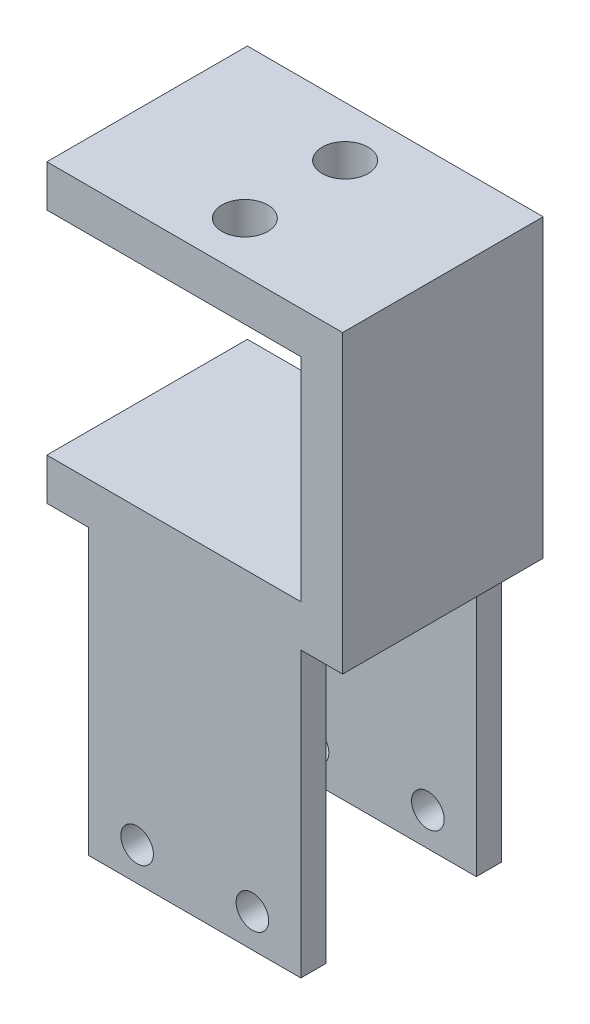
ISO-10303-21;
HEADER;
FILE_DESCRIPTION(('STEP AP214'),'2;1');
FILE_NAME('part.step','',(''),(''),'','','');
FILE_SCHEMA(('AUTOMOTIVE_DESIGN { 1 0 10303 214 1 1 1 1 }'));
ENDSEC;
DATA;
#1=APPLICATION_CONTEXT('core data for automotive mechanical design processes');
#2=APPLICATION_PROTOCOL_DEFINITION('international standard','automotive_design',2000,#1);
#3=PRODUCT_CONTEXT('',#1,'mechanical');
#4=PRODUCT('Part','Part','',(#3));
#5=PRODUCT_RELATED_PRODUCT_CATEGORY('part','',(#4));
#6=PRODUCT_DEFINITION_FORMATION('','',#4);
#7=PRODUCT_DEFINITION_CONTEXT('part definition',#1,'design');
#8=PRODUCT_DEFINITION('design','',#6,#7);
#9=PRODUCT_DEFINITION_SHAPE('','',#8);
#10=(LENGTH_UNIT() NAMED_UNIT(*) SI_UNIT(.MILLI.,.METRE.));
#11=(NAMED_UNIT(*) PLANE_ANGLE_UNIT() SI_UNIT($,.RADIAN.));
#12=(NAMED_UNIT(*) SI_UNIT($,.STERADIAN.) SOLID_ANGLE_UNIT());
#13=UNCERTAINTY_MEASURE_WITH_UNIT(LENGTH_MEASURE(1.E-05),#10,'distance_accuracy_value','');
#14=(GEOMETRIC_REPRESENTATION_CONTEXT(3) GLOBAL_UNCERTAINTY_ASSIGNED_CONTEXT((#13)) GLOBAL_UNIT_ASSIGNED_CONTEXT((#10,
#11,#12)) REPRESENTATION_CONTEXT('',''));
#15=CARTESIAN_POINT('',(0.,0.,0.));
#16=DIRECTION('',(0.,0.,1.));
#17=DIRECTION('',(1.,0.,0.));
#18=AXIS2_PLACEMENT_3D('',#15,#16,#17);
#19=CARTESIAN_POINT('',(-35.4,0.,24.));
#20=DIRECTION('',(1.,0.,0.));
#21=DIRECTION('',(0.,0.,-1.));
#22=AXIS2_PLACEMENT_3D('',#19,#20,#21);
#23=PLANE('',#22);
#24=DIRECTION('',(0.,-1.,0.));
#25=VECTOR('',#24,1.);
#26=CARTESIAN_POINT('',(-35.4,0.,0.));
#27=LINE('',#26,#25);
#28=CARTESIAN_POINT('',(-35.4,35.4,0.));
#29=VERTEX_POINT('',#28);
#30=CARTESIAN_POINT('',(-35.4,30.4,0.));
#31=VERTEX_POINT('',#30);
#32=EDGE_CURVE('E204',#29,#31,#27,.T.);
#33=ORIENTED_EDGE('',*,*,#32,.T.);
#34=DIRECTION('',(0.,0.,-1.));
#35=VECTOR('',#34,1.);
#36=CARTESIAN_POINT('',(-35.4,30.4,24.));
#37=LINE('',#36,#35);
#38=CARTESIAN_POINT('',(-35.4,30.4,24.));
#39=VERTEX_POINT('',#38);
#40=EDGE_CURVE('E173',#39,#31,#37,.T.);
#41=ORIENTED_EDGE('',*,*,#40,.F.);
#42=DIRECTION('',(0.,-1.,0.));
#43=VECTOR('',#42,1.);
#44=CARTESIAN_POINT('',(-35.4,0.,24.));
#45=LINE('',#44,#43);
#46=CARTESIAN_POINT('',(-35.4,35.4,24.));
#47=VERTEX_POINT('',#46);
#48=EDGE_CURVE('E179',#47,#39,#45,.T.);
#49=ORIENTED_EDGE('',*,*,#48,.F.);
#50=DIRECTION('',(0.,0.,-1.));
#51=VECTOR('',#50,1.);
#52=CARTESIAN_POINT('',(-35.4,35.4,24.));
#53=LINE('',#52,#51);
#54=EDGE_CURVE('E236',#47,#29,#53,.T.);
#55=ORIENTED_EDGE('',*,*,#54,.T.);
#56=EDGE_LOOP('',(#33,#41,#49,#55));
#57=FACE_BOUND('',#56,.T.);
#58=ADVANCED_FACE('F39',(#57),#23,.F.);
#59=CARTESIAN_POINT('',(-30.4,-34.,24.));
#60=DIRECTION('',(1.,0.,0.));
#61=DIRECTION('',(0.,0.,-1.));
#62=AXIS2_PLACEMENT_3D('',#59,#60,#61);
#63=PLANE('',#62);
#64=DIRECTION('',(0.,0.,-1.));
#65=VECTOR('',#64,1.);
#66=CARTESIAN_POINT('',(-30.4,-34.,24.));
#67=LINE('',#66,#65);
#68=CARTESIAN_POINT('',(-30.4,-34.,3.));
#69=VERTEX_POINT('',#68);
#70=CARTESIAN_POINT('',(-30.4,-34.,0.));
#71=VERTEX_POINT('',#70);
#72=EDGE_CURVE('E227',#69,#71,#67,.T.);
#73=ORIENTED_EDGE('',*,*,#72,.F.);
#74=DIRECTION('',(0.,1.,0.));
#75=VECTOR('',#74,1.);
#76=CARTESIAN_POINT('',(-30.4,-34.,3.));
#77=LINE('',#76,#75);
#78=CARTESIAN_POINT('',(-30.4,0.,3.));
#79=VERTEX_POINT('',#78);
#80=EDGE_CURVE('E274',#69,#79,#77,.T.);
#81=ORIENTED_EDGE('',*,*,#80,.T.);
#82=DIRECTION('',(0.,0.,-1.));
#83=VECTOR('',#82,1.);
#84=CARTESIAN_POINT('',(-30.4,0.,24.));
#85=LINE('',#84,#83);
#86=CARTESIAN_POINT('',(-30.4,0.,0.));
#87=VERTEX_POINT('',#86);
#88=EDGE_CURVE('E231',#79,#87,#85,.T.);
#89=ORIENTED_EDGE('',*,*,#88,.T.);
#90=DIRECTION('',(0.,-1.,0.));
#91=VECTOR('',#90,1.);
#92=CARTESIAN_POINT('',(-30.4,-34.,0.));
#93=LINE('',#92,#91);
#94=EDGE_CURVE('E210',#87,#71,#93,.T.);
#95=ORIENTED_EDGE('',*,*,#94,.T.);
#96=EDGE_LOOP('',(#73,#81,#89,#95));
#97=FACE_BOUND('',#96,.T.);
#98=ADVANCED_FACE('F336',(#97),#63,.F.);
#99=CARTESIAN_POINT('',(-30.4,-34.,24.));
#100=DIRECTION('',(0.,1.,0.));
#101=DIRECTION('',(0.,0.,1.));
#102=AXIS2_PLACEMENT_3D('',#99,#100,#101);
#103=PLANE('',#102);
#104=DIRECTION('',(0.,0.,-1.));
#105=VECTOR('',#104,1.);
#106=CARTESIAN_POINT('',(-5.,-34.,24.));
#107=LINE('',#106,#105);
#108=CARTESIAN_POINT('',(-5.,-34.,3.));
#109=VERTEX_POINT('',#108);
#110=CARTESIAN_POINT('',(-5.,-34.,0.));
#111=VERTEX_POINT('',#110);
#112=EDGE_CURVE('E223',#109,#111,#107,.T.);
#113=ORIENTED_EDGE('',*,*,#112,.F.);
#114=DIRECTION('',(-1.,0.,0.));
#115=VECTOR('',#114,1.);
#116=CARTESIAN_POINT('',(0.,-34.,3.));
#117=LINE('',#116,#115);
#118=EDGE_CURVE('E260',#109,#69,#117,.T.);
#119=ORIENTED_EDGE('',*,*,#118,.T.);
#120=ORIENTED_EDGE('',*,*,#72,.T.);
#121=DIRECTION('',(1.,0.,0.));
#122=VECTOR('',#121,1.);
#123=CARTESIAN_POINT('',(-30.4,-34.,0.));
#124=LINE('',#123,#122);
#125=EDGE_CURVE('E213',#71,#111,#124,.T.);
#126=ORIENTED_EDGE('',*,*,#125,.T.);
#127=EDGE_LOOP('',(#113,#119,#120,#126));
#128=FACE_BOUND('',#127,.T.);
#129=ADVANCED_FACE('F343',(#128),#103,.F.);
#130=CARTESIAN_POINT('',(-4.99999999999999,0.,24.));
#131=DIRECTION('',(-1.,0.,0.));
#132=DIRECTION('',(0.,-1.,0.));
#133=AXIS2_PLACEMENT_3D('',#130,#131,#132);
#134=PLANE('',#133);
#135=DIRECTION('',(0.,0.,-1.));
#136=VECTOR('',#135,1.);
#137=CARTESIAN_POINT('',(-4.99999999999999,0.,24.));
#138=LINE('',#137,#136);
#139=CARTESIAN_POINT('',(-4.99999999999999,0.,3.));
#140=VERTEX_POINT('',#139);
#141=CARTESIAN_POINT('',(-4.99999999999999,0.,0.));
#142=VERTEX_POINT('',#141);
#143=EDGE_CURVE('E194',#140,#142,#138,.T.);
#144=ORIENTED_EDGE('',*,*,#143,.F.);
#145=DIRECTION('',(0.,-1.,0.));
#146=VECTOR('',#145,1.);
#147=CARTESIAN_POINT('',(-4.99999999999999,0.,3.));
#148=LINE('',#147,#146);
#149=EDGE_CURVE('E271',#140,#109,#148,.T.);
#150=ORIENTED_EDGE('',*,*,#149,.T.);
#151=ORIENTED_EDGE('',*,*,#112,.T.);
#152=DIRECTION('',(0.,1.,0.));
#153=VECTOR('',#152,1.);
#154=CARTESIAN_POINT('',(-4.99999999999999,0.,0.));
#155=LINE('',#154,#153);
#156=EDGE_CURVE('E216',#111,#142,#155,.T.);
#157=ORIENTED_EDGE('',*,*,#156,.T.);
#158=EDGE_LOOP('',(#144,#150,#151,#157));
#159=FACE_BOUND('',#158,.T.);
#160=ADVANCED_FACE('F410',(#159),#134,.F.);
#161=CARTESIAN_POINT('',(-24.6,-30.,24.));
#162=DIRECTION('',(0.,0.,-1.));
#163=DIRECTION('',(-1.,0.,0.));
#164=AXIS2_PLACEMENT_3D('',#161,#162,#163);
#165=CYLINDRICAL_SURFACE('',#164,1.95);
#166=CARTESIAN_POINT('',(-24.6,-30.,3.));
#167=DIRECTION('',(0.,0.,-1.));
#168=DIRECTION('',(0.,1.,0.));
#169=AXIS2_PLACEMENT_3D('',#166,#167,#168);
#170=CIRCLE('',#169,1.95);
#171=CARTESIAN_POINT('',(-24.6,-28.05,3.));
#172=VERTEX_POINT('',#171);
#173=EDGE_CURVE('E268',#172,#172,#170,.T.);
#174=ORIENTED_EDGE('',*,*,#173,.F.);
#175=EDGE_LOOP('',(#174));
#176=FACE_BOUND('',#175,.T.);
#177=CARTESIAN_POINT('',(-24.6,-30.,0.));
#178=DIRECTION('',(0.,0.,1.));
#179=DIRECTION('',(1.,0.,0.));
#180=AXIS2_PLACEMENT_3D('',#177,#178,#179);
#181=CIRCLE('',#180,1.95);
#182=CARTESIAN_POINT('',(-22.65,-30.,0.));
#183=VERTEX_POINT('',#182);
#184=EDGE_CURVE('E280',#183,#183,#181,.T.);
#185=ORIENTED_EDGE('',*,*,#184,.F.);
#186=EDGE_LOOP('',(#185));
#187=FACE_BOUND('',#186,.T.);
#188=ADVANCED_FACE('F404',(#176,#187),#165,.F.);
#189=CARTESIAN_POINT('',(-10.8,-30.,24.));
#190=DIRECTION('',(0.,0.,-1.));
#191=DIRECTION('',(-1.,0.,0.));
#192=AXIS2_PLACEMENT_3D('',#189,#190,#191);
#193=CYLINDRICAL_SURFACE('',#192,1.95);
#194=CARTESIAN_POINT('',(-10.8,-30.,3.));
#195=DIRECTION('',(0.,0.,-1.));
#196=DIRECTION('',(0.,1.,0.));
#197=AXIS2_PLACEMENT_3D('',#194,#195,#196);
#198=CIRCLE('',#197,1.95);
#199=CARTESIAN_POINT('',(-10.8,-28.05,3.));
#200=VERTEX_POINT('',#199);
#201=EDGE_CURVE('E43',#200,#200,#198,.T.);
#202=ORIENTED_EDGE('',*,*,#201,.F.);
#203=EDGE_LOOP('',(#202));
#204=FACE_BOUND('',#203,.T.);
#205=CARTESIAN_POINT('',(-10.8,-30.,0.));
#206=DIRECTION('',(0.,0.,1.));
#207=DIRECTION('',(1.,0.,0.));
#208=AXIS2_PLACEMENT_3D('',#205,#206,#207);
#209=CIRCLE('',#208,1.95);
#210=CARTESIAN_POINT('',(-8.85,-30.,0.));
#211=VERTEX_POINT('',#210);
#212=EDGE_CURVE('E276',#211,#211,#209,.T.);
#213=ORIENTED_EDGE('',*,*,#212,.F.);
#214=EDGE_LOOP('',(#213));
#215=FACE_BOUND('',#214,.T.);
#216=ADVANCED_FACE('F402',(#204,#215),#193,.F.);
#217=CARTESIAN_POINT('',(0.,0.,24.));
#218=DIRECTION('',(0.,0.,1.));
#219=DIRECTION('',(1.,0.,0.));
#220=AXIS2_PLACEMENT_3D('',#217,#218,#219);
#221=PLANE('',#220);
#222=ORIENTED_EDGE('',*,*,#48,.T.);
#223=DIRECTION('',(-1.,0.,0.));
#224=VECTOR('',#223,1.);
#225=CARTESIAN_POINT('',(-30.4,30.4,24.));
#226=LINE('',#225,#224);
#227=CARTESIAN_POINT('',(-5.,30.4,24.));
#228=VERTEX_POINT('',#227);
#229=EDGE_CURVE('E289',#228,#39,#226,.T.);
#230=ORIENTED_EDGE('',*,*,#229,.F.);
#231=DIRECTION('',(0.,1.,0.));
#232=VECTOR('',#231,1.);
#233=CARTESIAN_POINT('',(-5.,30.4,24.));
#234=LINE('',#233,#232);
#235=CARTESIAN_POINT('',(-5.,5.,24.));
#236=VERTEX_POINT('',#235);
#237=EDGE_CURVE('E161',#236,#228,#234,.T.);
#238=ORIENTED_EDGE('',*,*,#237,.F.);
#239=DIRECTION('',(1.,0.,0.));
#240=VECTOR('',#239,1.);
#241=CARTESIAN_POINT('',(-30.4,5.,24.));
#242=LINE('',#241,#240);
#243=CARTESIAN_POINT('',(-35.4,5.,24.));
#244=VERTEX_POINT('',#243);
#245=EDGE_CURVE('E152',#244,#236,#242,.T.);
#246=ORIENTED_EDGE('',*,*,#245,.F.);
#247=CARTESIAN_POINT('',(-35.4,0.,24.));
#248=VERTEX_POINT('',#247);
#249=EDGE_CURVE('E158',#244,#248,#45,.T.);
#250=ORIENTED_EDGE('',*,*,#249,.T.);
#251=DIRECTION('',(1.,0.,0.));
#252=VECTOR('',#251,1.);
#253=CARTESIAN_POINT('',(-35.4,0.,24.));
#254=LINE('',#253,#252);
#255=CARTESIAN_POINT('',(-30.4,0.,24.));
#256=VERTEX_POINT('',#255);
#257=EDGE_CURVE('E182',#248,#256,#254,.T.);
#258=ORIENTED_EDGE('',*,*,#257,.T.);
#259=DIRECTION('',(0.,-1.,0.));
#260=VECTOR('',#259,1.);
#261=CARTESIAN_POINT('',(-30.4,-34.,24.));
#262=LINE('',#261,#260);
#263=CARTESIAN_POINT('',(-30.4,-34.,24.));
#264=VERTEX_POINT('',#263);
#265=EDGE_CURVE('E188',#256,#264,#262,.T.);
#266=ORIENTED_EDGE('',*,*,#265,.T.);
#267=DIRECTION('',(1.,0.,0.));
#268=VECTOR('',#267,1.);
#269=CARTESIAN_POINT('',(-30.4,-34.,24.));
#270=LINE('',#269,#268);
#271=CARTESIAN_POINT('',(-5.,-34.,24.));
#272=VERTEX_POINT('',#271);
#273=EDGE_CURVE('E190',#264,#272,#270,.T.);
#274=ORIENTED_EDGE('',*,*,#273,.T.);
#275=DIRECTION('',(0.,1.,0.));
#276=VECTOR('',#275,1.);
#277=CARTESIAN_POINT('',(-4.99999999999999,0.,24.));
#278=LINE('',#277,#276);
#279=CARTESIAN_POINT('',(-4.99999999999999,0.,24.));
#280=VERTEX_POINT('',#279);
#281=EDGE_CURVE('E192',#272,#280,#278,.T.);
#282=ORIENTED_EDGE('',*,*,#281,.T.);
#283=DIRECTION('',(1.,0.,0.));
#284=VECTOR('',#283,1.);
#285=CARTESIAN_POINT('',(0.,0.,24.));
#286=LINE('',#285,#284);
#287=CARTESIAN_POINT('',(0.,0.,24.));
#288=VERTEX_POINT('',#287);
#289=EDGE_CURVE('E219',#280,#288,#286,.T.);
#290=ORIENTED_EDGE('',*,*,#289,.T.);
#291=DIRECTION('',(0.,1.,0.));
#292=VECTOR('',#291,1.);
#293=CARTESIAN_POINT('',(0.,0.,24.));
#294=LINE('',#293,#292);
#295=CARTESIAN_POINT('',(0.,35.4,24.));
#296=VERTEX_POINT('',#295);
#297=EDGE_CURVE('E183',#288,#296,#294,.T.);
#298=ORIENTED_EDGE('',*,*,#297,.T.);
#299=DIRECTION('',(-1.,0.,0.));
#300=VECTOR('',#299,1.);
#301=CARTESIAN_POINT('',(0.,35.4,24.));
#302=LINE('',#301,#300);
#303=EDGE_CURVE('E180',#296,#47,#302,.T.);
#304=ORIENTED_EDGE('',*,*,#303,.T.);
#305=EDGE_LOOP('',(#222,#230,#238,#246,#250,#258,#266,#274,#282,#290,#298,#304));
#306=FACE_BOUND('',#305,.T.);
#307=CARTESIAN_POINT('',(-24.6,-30.,24.));
#308=DIRECTION('',(0.,0.,1.));
#309=DIRECTION('',(1.,0.,0.));
#310=AXIS2_PLACEMENT_3D('',#307,#308,#309);
#311=CIRCLE('',#310,1.95);
#312=CARTESIAN_POINT('',(-22.65,-30.,24.));
#313=VERTEX_POINT('',#312);
#314=EDGE_CURVE('E283',#313,#313,#311,.T.);
#315=ORIENTED_EDGE('',*,*,#314,.F.);
#316=EDGE_LOOP('',(#315));
#317=FACE_BOUND('',#316,.T.);
#318=CARTESIAN_POINT('',(-10.8,-30.,24.));
#319=DIRECTION('',(0.,0.,1.));
#320=DIRECTION('',(1.,0.,0.));
#321=AXIS2_PLACEMENT_3D('',#318,#319,#320);
#322=CIRCLE('',#321,1.95);
#323=CARTESIAN_POINT('',(-8.85,-30.,24.));
#324=VERTEX_POINT('',#323);
#325=EDGE_CURVE('E277',#324,#324,#322,.T.);
#326=ORIENTED_EDGE('',*,*,#325,.F.);
#327=EDGE_LOOP('',(#326));
#328=FACE_BOUND('',#327,.T.);
#329=ADVANCED_FACE('F155',(#306,#317,#328),#221,.T.);
#330=CARTESIAN_POINT('',(0.,0.,0.));
#331=DIRECTION('',(0.,0.,1.));
#332=DIRECTION('',(1.,0.,0.));
#333=AXIS2_PLACEMENT_3D('',#330,#331,#332);
#334=PLANE('',#333);
#335=DIRECTION('',(-1.,0.,0.));
#336=VECTOR('',#335,1.);
#337=CARTESIAN_POINT('',(-30.4,30.4,0.));
#338=LINE('',#337,#336);
#339=CARTESIAN_POINT('',(-5.,30.4,0.));
#340=VERTEX_POINT('',#339);
#341=EDGE_CURVE('E164',#340,#31,#338,.T.);
#342=ORIENTED_EDGE('',*,*,#341,.T.);
#343=ORIENTED_EDGE('',*,*,#32,.F.);
#344=DIRECTION('',(-1.,0.,0.));
#345=VECTOR('',#344,1.);
#346=CARTESIAN_POINT('',(0.,35.4,0.));
#347=LINE('',#346,#345);
#348=CARTESIAN_POINT('',(0.,35.4,0.));
#349=VERTEX_POINT('',#348);
#350=EDGE_CURVE('E201',#349,#29,#347,.T.);
#351=ORIENTED_EDGE('',*,*,#350,.F.);
#352=DIRECTION('',(0.,1.,0.));
#353=VECTOR('',#352,1.);
#354=CARTESIAN_POINT('',(0.,0.,0.));
#355=LINE('',#354,#353);
#356=CARTESIAN_POINT('',(0.,0.,0.));
#357=VERTEX_POINT('',#356);
#358=EDGE_CURVE('E198',#357,#349,#355,.T.);
#359=ORIENTED_EDGE('',*,*,#358,.F.);
#360=DIRECTION('',(1.,0.,0.));
#361=VECTOR('',#360,1.);
#362=CARTESIAN_POINT('',(0.,0.,0.));
#363=LINE('',#362,#361);
#364=EDGE_CURVE('E195',#142,#357,#363,.T.);
#365=ORIENTED_EDGE('',*,*,#364,.F.);
#366=ORIENTED_EDGE('',*,*,#156,.F.);
#367=ORIENTED_EDGE('',*,*,#125,.F.);
#368=ORIENTED_EDGE('',*,*,#94,.F.);
#369=DIRECTION('',(1.,0.,0.));
#370=VECTOR('',#369,1.);
#371=CARTESIAN_POINT('',(-35.4,0.,0.));
#372=LINE('',#371,#370);
#373=CARTESIAN_POINT('',(-35.4,0.,0.));
#374=VERTEX_POINT('',#373);
#375=EDGE_CURVE('E207',#374,#87,#372,.T.);
#376=ORIENTED_EDGE('',*,*,#375,.F.);
#377=CARTESIAN_POINT('',(-35.4,5.,0.));
#378=VERTEX_POINT('',#377);
#379=EDGE_CURVE('E203',#378,#374,#27,.T.);
#380=ORIENTED_EDGE('',*,*,#379,.F.);
#381=DIRECTION('',(1.,0.,0.));
#382=VECTOR('',#381,1.);
#383=CARTESIAN_POINT('',(-30.4,5.,0.));
#384=LINE('',#383,#382);
#385=CARTESIAN_POINT('',(-5.,5.,0.));
#386=VERTEX_POINT('',#385);
#387=EDGE_CURVE('E170',#378,#386,#384,.T.);
#388=ORIENTED_EDGE('',*,*,#387,.T.);
#389=DIRECTION('',(0.,1.,0.));
#390=VECTOR('',#389,1.);
#391=CARTESIAN_POINT('',(-5.,30.4,0.));
#392=LINE('',#391,#390);
#393=EDGE_CURVE('E292',#386,#340,#392,.T.);
#394=ORIENTED_EDGE('',*,*,#393,.T.);
#395=EDGE_LOOP('',(#342,#343,#351,#359,#365,#366,#367,#368,#376,#380,#388,#394));
#396=FACE_BOUND('',#395,.T.);
#397=ORIENTED_EDGE('',*,*,#184,.T.);
#398=EDGE_LOOP('',(#397));
#399=FACE_BOUND('',#398,.T.);
#400=ORIENTED_EDGE('',*,*,#212,.T.);
#401=EDGE_LOOP('',(#400));
#402=FACE_BOUND('',#401,.T.);
#403=ADVANCED_FACE('F317',(#396,#399,#402),#334,.F.);
#404=CARTESIAN_POINT('',(0.,0.,24.));
#405=DIRECTION('',(-1.,0.,0.));
#406=DIRECTION('',(0.,0.,1.));
#407=AXIS2_PLACEMENT_3D('',#404,#405,#406);
#408=PLANE('',#407);
#409=ORIENTED_EDGE('',*,*,#358,.T.);
#410=DIRECTION('',(0.,0.,-1.));
#411=VECTOR('',#410,1.);
#412=CARTESIAN_POINT('',(0.,35.4,24.));
#413=LINE('',#412,#411);
#414=EDGE_CURVE('E48',#296,#349,#413,.T.);
#415=ORIENTED_EDGE('',*,*,#414,.F.);
#416=ORIENTED_EDGE('',*,*,#297,.F.);
#417=DIRECTION('',(0.,0.,-1.));
#418=VECTOR('',#417,1.);
#419=CARTESIAN_POINT('',(0.,0.,24.));
#420=LINE('',#419,#418);
#421=EDGE_CURVE('E12',#288,#357,#420,.T.);
#422=ORIENTED_EDGE('',*,*,#421,.T.);
#423=EDGE_LOOP('',(#409,#415,#416,#422));
#424=FACE_BOUND('',#423,.T.);
#425=ADVANCED_FACE('F41',(#424),#408,.F.);
#426=CARTESIAN_POINT('',(0.,35.4,24.));
#427=DIRECTION('',(0.,-1.,0.));
#428=DIRECTION('',(1.,0.,0.));
#429=AXIS2_PLACEMENT_3D('',#426,#427,#428);
#430=PLANE('',#429);
#431=CARTESIAN_POINT('',(-17.7,35.4,6.));
#432=DIRECTION('',(0.,1.,0.));
#433=DIRECTION('',(-1.,0.,0.));
#434=AXIS2_PLACEMENT_3D('',#431,#432,#433);
#435=CIRCLE('',#434,2.75);
#436=CARTESIAN_POINT('',(-20.45,35.4,6.));
#437=VERTEX_POINT('',#436);
#438=EDGE_CURVE('E262',#437,#437,#435,.T.);
#439=ORIENTED_EDGE('',*,*,#438,.F.);
#440=EDGE_LOOP('',(#439));
#441=FACE_BOUND('',#440,.T.);
#442=CARTESIAN_POINT('',(-17.7,35.4,18.));
#443=DIRECTION('',(0.,1.,0.));
#444=DIRECTION('',(-1.,0.,0.));
#445=AXIS2_PLACEMENT_3D('',#442,#443,#444);
#446=CIRCLE('',#445,2.75);
#447=CARTESIAN_POINT('',(-20.45,35.4,18.));
#448=VERTEX_POINT('',#447);
#449=EDGE_CURVE('E256',#448,#448,#446,.T.);
#450=ORIENTED_EDGE('',*,*,#449,.F.);
#451=EDGE_LOOP('',(#450));
#452=FACE_BOUND('',#451,.T.);
#453=ORIENTED_EDGE('',*,*,#350,.T.);
#454=ORIENTED_EDGE('',*,*,#54,.F.);
#455=ORIENTED_EDGE('',*,*,#303,.F.);
#456=ORIENTED_EDGE('',*,*,#414,.T.);
#457=EDGE_LOOP('',(#453,#454,#455,#456));
#458=FACE_BOUND('',#457,.T.);
#459=ADVANCED_FACE('F308',(#441,#452,#458),#430,.F.);
#460=ORIENTED_EDGE('',*,*,#249,.F.);
#461=DIRECTION('',(0.,0.,-1.));
#462=VECTOR('',#461,1.);
#463=CARTESIAN_POINT('',(-35.4,5.,24.));
#464=LINE('',#463,#462);
#465=EDGE_CURVE('E167',#244,#378,#464,.T.);
#466=ORIENTED_EDGE('',*,*,#465,.T.);
#467=ORIENTED_EDGE('',*,*,#379,.T.);
#468=DIRECTION('',(0.,0.,-1.));
#469=VECTOR('',#468,1.);
#470=CARTESIAN_POINT('',(-35.4,0.,24.));
#471=LINE('',#470,#469);
#472=EDGE_CURVE('E177',#248,#374,#471,.T.);
#473=ORIENTED_EDGE('',*,*,#472,.F.);
#474=EDGE_LOOP('',(#460,#466,#467,#473));
#475=FACE_BOUND('',#474,.T.);
#476=ADVANCED_FACE('F175',(#475),#23,.F.);
#477=CARTESIAN_POINT('',(-35.4,0.,24.));
#478=DIRECTION('',(0.,1.,0.));
#479=DIRECTION('',(0.,0.,1.));
#480=AXIS2_PLACEMENT_3D('',#477,#478,#479);
#481=PLANE('',#480);
#482=ORIENTED_EDGE('',*,*,#472,.T.);
#483=ORIENTED_EDGE('',*,*,#375,.T.);
#484=ORIENTED_EDGE('',*,*,#88,.F.);
#485=DIRECTION('',(-1.,0.,0.));
#486=VECTOR('',#485,1.);
#487=CARTESIAN_POINT('',(0.,0.,3.));
#488=LINE('',#487,#486);
#489=EDGE_CURVE('E243',#140,#79,#488,.T.);
#490=ORIENTED_EDGE('',*,*,#489,.F.);
#491=ORIENTED_EDGE('',*,*,#143,.T.);
#492=ORIENTED_EDGE('',*,*,#364,.T.);
#493=ORIENTED_EDGE('',*,*,#421,.F.);
#494=ORIENTED_EDGE('',*,*,#289,.F.);
#495=CARTESIAN_POINT('',(-4.99999999999999,0.,21.));
#496=VERTEX_POINT('',#495);
#497=EDGE_CURVE('E220',#280,#496,#138,.T.);
#498=ORIENTED_EDGE('',*,*,#497,.T.);
#499=DIRECTION('',(-1.,0.,0.));
#500=VECTOR('',#499,1.);
#501=CARTESIAN_POINT('',(0.,0.,21.));
#502=LINE('',#501,#500);
#503=CARTESIAN_POINT('',(-30.4,0.,21.));
#504=VERTEX_POINT('',#503);
#505=EDGE_CURVE('E56',#496,#504,#502,.T.);
#506=ORIENTED_EDGE('',*,*,#505,.T.);
#507=EDGE_CURVE('E232',#256,#504,#85,.T.);
#508=ORIENTED_EDGE('',*,*,#507,.F.);
#509=ORIENTED_EDGE('',*,*,#257,.F.);
#510=EDGE_LOOP('',(#482,#483,#484,#490,#491,#492,#493,#494,#498,#506,#508,#509));
#511=FACE_BOUND('',#510,.T.);
#512=ADVANCED_FACE('F349',(#511),#481,.F.);
#513=ORIENTED_EDGE('',*,*,#507,.T.);
#514=DIRECTION('',(0.,-1.,0.));
#515=VECTOR('',#514,1.);
#516=CARTESIAN_POINT('',(-30.4,-34.,21.));
#517=LINE('',#516,#515);
#518=CARTESIAN_POINT('',(-30.4,-34.,21.));
#519=VERTEX_POINT('',#518);
#520=EDGE_CURVE('E265',#504,#519,#517,.T.);
#521=ORIENTED_EDGE('',*,*,#520,.T.);
#522=EDGE_CURVE('E228',#264,#519,#67,.T.);
#523=ORIENTED_EDGE('',*,*,#522,.F.);
#524=ORIENTED_EDGE('',*,*,#265,.F.);
#525=EDGE_LOOP('',(#513,#521,#523,#524));
#526=FACE_BOUND('',#525,.T.);
#527=ADVANCED_FACE('F346',(#526),#63,.F.);
#528=ORIENTED_EDGE('',*,*,#522,.T.);
#529=DIRECTION('',(-1.,0.,0.));
#530=VECTOR('',#529,1.);
#531=CARTESIAN_POINT('',(0.,-34.0000000000001,21.));
#532=LINE('',#531,#530);
#533=CARTESIAN_POINT('',(-5.,-34.,21.));
#534=VERTEX_POINT('',#533);
#535=EDGE_CURVE('E253',#534,#519,#532,.T.);
#536=ORIENTED_EDGE('',*,*,#535,.F.);
#537=EDGE_CURVE('E224',#272,#534,#107,.T.);
#538=ORIENTED_EDGE('',*,*,#537,.F.);
#539=ORIENTED_EDGE('',*,*,#273,.F.);
#540=EDGE_LOOP('',(#528,#536,#538,#539));
#541=FACE_BOUND('',#540,.T.);
#542=ADVANCED_FACE('F430',(#541),#103,.F.);
#543=ORIENTED_EDGE('',*,*,#537,.T.);
#544=DIRECTION('',(0.,1.,0.));
#545=VECTOR('',#544,1.);
#546=CARTESIAN_POINT('',(-4.99999999999999,0.,21.));
#547=LINE('',#546,#545);
#548=EDGE_CURVE('E247',#534,#496,#547,.T.);
#549=ORIENTED_EDGE('',*,*,#548,.T.);
#550=ORIENTED_EDGE('',*,*,#497,.F.);
#551=ORIENTED_EDGE('',*,*,#281,.F.);
#552=EDGE_LOOP('',(#543,#549,#550,#551));
#553=FACE_BOUND('',#552,.T.);
#554=ADVANCED_FACE('F333',(#553),#134,.F.);
#555=CARTESIAN_POINT('',(-30.4,5.,24.));
#556=DIRECTION('',(0.,1.,0.));
#557=DIRECTION('',(0.,0.,1.));
#558=AXIS2_PLACEMENT_3D('',#555,#556,#557);
#559=PLANE('',#558);
#560=ORIENTED_EDGE('',*,*,#387,.F.);
#561=ORIENTED_EDGE('',*,*,#465,.F.);
#562=ORIENTED_EDGE('',*,*,#245,.T.);
#563=DIRECTION('',(0.,0.,-1.));
#564=VECTOR('',#563,1.);
#565=CARTESIAN_POINT('',(-5.,5.,24.));
#566=LINE('',#565,#564);
#567=EDGE_CURVE('E199',#236,#386,#566,.T.);
#568=ORIENTED_EDGE('',*,*,#567,.T.);
#569=EDGE_LOOP('',(#560,#561,#562,#568));
#570=FACE_BOUND('',#569,.T.);
#571=ADVANCED_FACE('F168',(#570),#559,.T.);
#572=CARTESIAN_POINT('',(-5.,30.4,24.));
#573=DIRECTION('',(-1.,0.,0.));
#574=DIRECTION('',(0.,-1.,0.));
#575=AXIS2_PLACEMENT_3D('',#572,#573,#574);
#576=PLANE('',#575);
#577=ORIENTED_EDGE('',*,*,#393,.F.);
#578=ORIENTED_EDGE('',*,*,#567,.F.);
#579=ORIENTED_EDGE('',*,*,#237,.T.);
#580=DIRECTION('',(0.,0.,-1.));
#581=VECTOR('',#580,1.);
#582=CARTESIAN_POINT('',(-5.,30.4,24.));
#583=LINE('',#582,#581);
#584=EDGE_CURVE('E64',#228,#340,#583,.T.);
#585=ORIENTED_EDGE('',*,*,#584,.T.);
#586=EDGE_LOOP('',(#577,#578,#579,#585));
#587=FACE_BOUND('',#586,.T.);
#588=ADVANCED_FACE('F321',(#587),#576,.T.);
#589=CARTESIAN_POINT('',(-30.4,30.4,24.));
#590=DIRECTION('',(0.,-1.,0.));
#591=DIRECTION('',(0.,0.,-1.));
#592=AXIS2_PLACEMENT_3D('',#589,#590,#591);
#593=PLANE('',#592);
#594=CARTESIAN_POINT('',(-17.7,30.4,6.));
#595=DIRECTION('',(0.,-1.,0.));
#596=DIRECTION('',(0.,0.,-1.));
#597=AXIS2_PLACEMENT_3D('',#594,#595,#596);
#598=CIRCLE('',#597,2.75);
#599=CARTESIAN_POINT('',(-17.7,30.4,3.25000000000001));
#600=VERTEX_POINT('',#599);
#601=EDGE_CURVE('E371',#600,#600,#598,.F.);
#602=ORIENTED_EDGE('',*,*,#601,.T.);
#603=EDGE_LOOP('',(#602));
#604=FACE_BOUND('',#603,.T.);
#605=CARTESIAN_POINT('',(-17.7,30.4,18.));
#606=DIRECTION('',(0.,-1.,0.));
#607=DIRECTION('',(0.,0.,-1.));
#608=AXIS2_PLACEMENT_3D('',#605,#606,#607);
#609=CIRCLE('',#608,2.75);
#610=CARTESIAN_POINT('',(-17.7,30.4,15.25));
#611=VERTEX_POINT('',#610);
#612=EDGE_CURVE('E369',#611,#611,#609,.F.);
#613=ORIENTED_EDGE('',*,*,#612,.T.);
#614=EDGE_LOOP('',(#613));
#615=FACE_BOUND('',#614,.T.);
#616=ORIENTED_EDGE('',*,*,#341,.F.);
#617=ORIENTED_EDGE('',*,*,#584,.F.);
#618=ORIENTED_EDGE('',*,*,#229,.T.);
#619=ORIENTED_EDGE('',*,*,#40,.T.);
#620=EDGE_LOOP('',(#616,#617,#618,#619));
#621=FACE_BOUND('',#620,.T.);
#622=ADVANCED_FACE('F314',(#604,#615,#621),#593,.T.);
#623=CARTESIAN_POINT('',(-24.6,-30.,21.));
#624=DIRECTION('',(0.,0.,1.));
#625=DIRECTION('',(1.,0.,0.));
#626=AXIS2_PLACEMENT_3D('',#623,#624,#625);
#627=CIRCLE('',#626,1.95);
#628=CARTESIAN_POINT('',(-22.65,-30.,21.));
#629=VERTEX_POINT('',#628);
#630=EDGE_CURVE('E242',#629,#629,#627,.T.);
#631=ORIENTED_EDGE('',*,*,#630,.F.);
#632=EDGE_LOOP('',(#631));
#633=FACE_BOUND('',#632,.T.);
#634=ORIENTED_EDGE('',*,*,#314,.T.);
#635=EDGE_LOOP('',(#634));
#636=FACE_BOUND('',#635,.T.);
#637=ADVANCED_FACE('F329',(#633,#636),#165,.F.);
#638=CARTESIAN_POINT('',(-10.8,-30.,21.));
#639=DIRECTION('',(0.,0.,1.));
#640=DIRECTION('',(1.,0.,0.));
#641=AXIS2_PLACEMENT_3D('',#638,#639,#640);
#642=CIRCLE('',#641,1.95);
#643=CARTESIAN_POINT('',(-8.85,-30.,21.));
#644=VERTEX_POINT('',#643);
#645=EDGE_CURVE('E240',#644,#644,#642,.T.);
#646=ORIENTED_EDGE('',*,*,#645,.F.);
#647=EDGE_LOOP('',(#646));
#648=FACE_BOUND('',#647,.T.);
#649=ORIENTED_EDGE('',*,*,#325,.T.);
#650=EDGE_LOOP('',(#649));
#651=FACE_BOUND('',#650,.T.);
#652=ADVANCED_FACE('F397',(#648,#651),#193,.F.);
#653=CARTESIAN_POINT('',(0.,-34.,3.));
#654=DIRECTION('',(0.,0.,-1.));
#655=DIRECTION('',(0.,1.,0.));
#656=AXIS2_PLACEMENT_3D('',#653,#654,#655);
#657=PLANE('',#656);
#658=ORIENTED_EDGE('',*,*,#173,.T.);
#659=EDGE_LOOP('',(#658));
#660=FACE_BOUND('',#659,.T.);
#661=ORIENTED_EDGE('',*,*,#201,.T.);
#662=EDGE_LOOP('',(#661));
#663=FACE_BOUND('',#662,.T.);
#664=ORIENTED_EDGE('',*,*,#118,.F.);
#665=ORIENTED_EDGE('',*,*,#149,.F.);
#666=ORIENTED_EDGE('',*,*,#489,.T.);
#667=ORIENTED_EDGE('',*,*,#80,.F.);
#668=EDGE_LOOP('',(#664,#665,#666,#667));
#669=FACE_BOUND('',#668,.T.);
#670=ADVANCED_FACE('F393',(#660,#663,#669),#657,.F.);
#671=CARTESIAN_POINT('',(0.,-34.0000000000001,21.));
#672=DIRECTION('',(0.,0.,1.));
#673=DIRECTION('',(1.,0.,0.));
#674=AXIS2_PLACEMENT_3D('',#671,#672,#673);
#675=PLANE('',#674);
#676=ORIENTED_EDGE('',*,*,#630,.T.);
#677=EDGE_LOOP('',(#676));
#678=FACE_BOUND('',#677,.T.);
#679=ORIENTED_EDGE('',*,*,#645,.T.);
#680=EDGE_LOOP('',(#679));
#681=FACE_BOUND('',#680,.T.);
#682=ORIENTED_EDGE('',*,*,#505,.F.);
#683=ORIENTED_EDGE('',*,*,#548,.F.);
#684=ORIENTED_EDGE('',*,*,#535,.T.);
#685=ORIENTED_EDGE('',*,*,#520,.F.);
#686=EDGE_LOOP('',(#682,#683,#684,#685));
#687=FACE_BOUND('',#686,.T.);
#688=ADVANCED_FACE('F386',(#678,#681,#687),#675,.F.);
#689=CARTESIAN_POINT('',(-17.7,-34.0010000000001,18.));
#690=DIRECTION('',(0.,1.,0.));
#691=DIRECTION('',(-1.,0.,0.));
#692=AXIS2_PLACEMENT_3D('',#689,#690,#691);
#693=CYLINDRICAL_SURFACE('',#692,2.75);
#694=ORIENTED_EDGE('',*,*,#612,.F.);
#695=EDGE_LOOP('',(#694));
#696=FACE_BOUND('',#695,.T.);
#697=ORIENTED_EDGE('',*,*,#449,.T.);
#698=EDGE_LOOP('',(#697));
#699=FACE_BOUND('',#698,.T.);
#700=ADVANCED_FACE('F380',(#696,#699),#693,.F.);
#701=CARTESIAN_POINT('',(-17.7,-34.0010000000001,6.));
#702=DIRECTION('',(0.,1.,0.));
#703=DIRECTION('',(-1.,0.,0.));
#704=AXIS2_PLACEMENT_3D('',#701,#702,#703);
#705=CYLINDRICAL_SURFACE('',#704,2.75);
#706=ORIENTED_EDGE('',*,*,#601,.F.);
#707=EDGE_LOOP('',(#706));
#708=FACE_BOUND('',#707,.T.);
#709=ORIENTED_EDGE('',*,*,#438,.T.);
#710=EDGE_LOOP('',(#709));
#711=FACE_BOUND('',#710,.T.);
#712=ADVANCED_FACE('F378',(#708,#711),#705,.F.);
#713=CLOSED_SHELL('',(#58,#98,#129,#160,#188,#216,#329,#403,#425,#459,#476,#512,#527,#542,#554,
#571,#588,#622,#637,#652,#670,#688,#700,#712));
#714=MANIFOLD_SOLID_BREP('B2',#713);
#715=ADVANCED_BREP_SHAPE_REPRESENTATION('',(#18,#714),#14);
#716=SHAPE_DEFINITION_REPRESENTATION(#9,#715);
ENDSEC;
END-ISO-10303-21;
